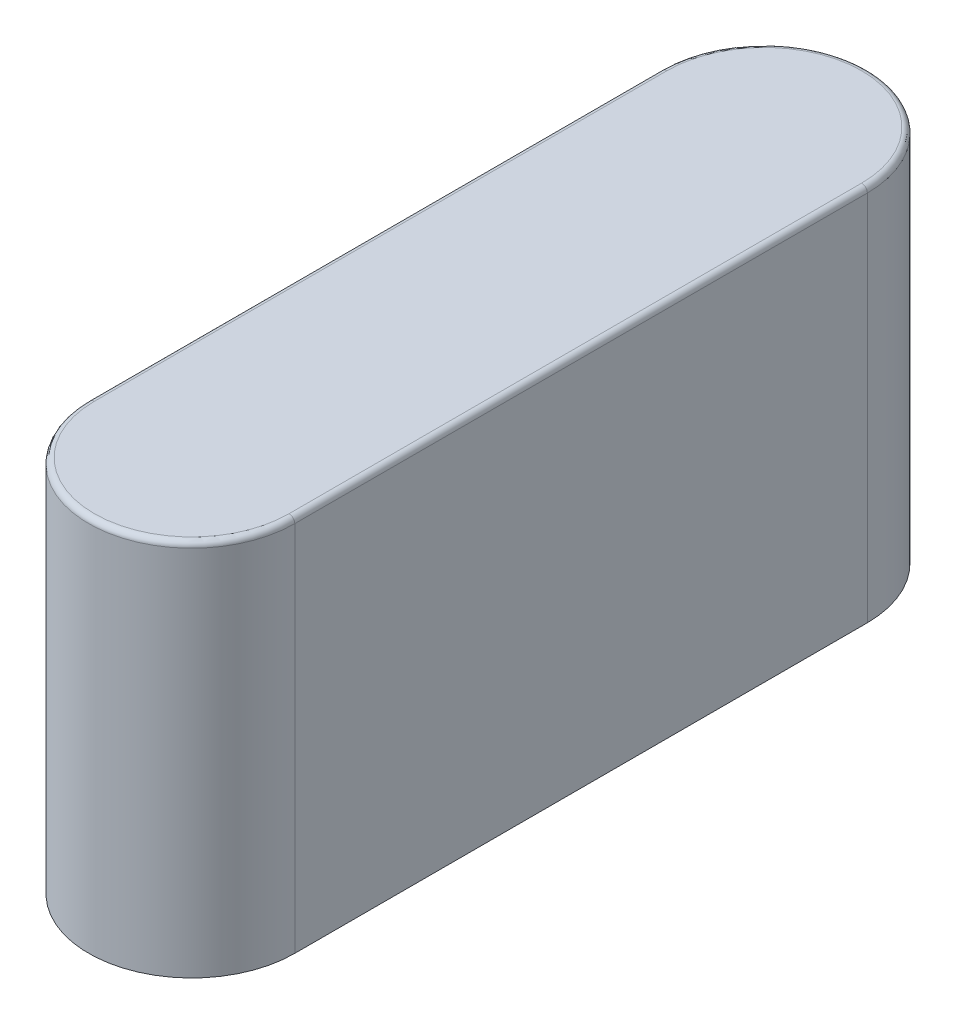
ISO-10303-21;
HEADER;
FILE_DESCRIPTION(('STEP AP214'),'2;1');
FILE_NAME('part.step','',(''),(''),'','','');
FILE_SCHEMA(('AUTOMOTIVE_DESIGN { 1 0 10303 214 1 1 1 1 }'));
ENDSEC;
DATA;
#1=APPLICATION_CONTEXT('core data for automotive mechanical design processes');
#2=APPLICATION_PROTOCOL_DEFINITION('international standard','automotive_design',2000,#1);
#3=PRODUCT_CONTEXT('',#1,'mechanical');
#4=PRODUCT('Part','Part','',(#3));
#5=PRODUCT_RELATED_PRODUCT_CATEGORY('part','',(#4));
#6=PRODUCT_DEFINITION_FORMATION('','',#4);
#7=PRODUCT_DEFINITION_CONTEXT('part definition',#1,'design');
#8=PRODUCT_DEFINITION('design','',#6,#7);
#9=PRODUCT_DEFINITION_SHAPE('','',#8);
#10=(LENGTH_UNIT() NAMED_UNIT(*) SI_UNIT(.MILLI.,.METRE.));
#11=(NAMED_UNIT(*) PLANE_ANGLE_UNIT() SI_UNIT($,.RADIAN.));
#12=(NAMED_UNIT(*) SI_UNIT($,.STERADIAN.) SOLID_ANGLE_UNIT());
#13=UNCERTAINTY_MEASURE_WITH_UNIT(LENGTH_MEASURE(1.E-05),#10,'distance_accuracy_value','');
#14=(GEOMETRIC_REPRESENTATION_CONTEXT(3) GLOBAL_UNCERTAINTY_ASSIGNED_CONTEXT((#13)) GLOBAL_UNIT_ASSIGNED_CONTEXT((#10,
#11,#12)) REPRESENTATION_CONTEXT('',''));
#15=CARTESIAN_POINT('',(0.,0.,0.));
#16=DIRECTION('',(0.,0.,1.));
#17=DIRECTION('',(1.,0.,0.));
#18=AXIS2_PLACEMENT_3D('',#15,#16,#17);
#19=CARTESIAN_POINT('',(0.,1.625,0.744583489501109));
#20=DIRECTION('',(0.,-1.,0.));
#21=DIRECTION('',(0.,0.,-1.));
#22=AXIS2_PLACEMENT_3D('',#19,#20,#21);
#23=TOROIDAL_SURFACE('',#22,0.425,0.025);
#24=CARTESIAN_POINT('',(0.,1.65,0.744583489501109));
#25=DIRECTION('',(0.,1.,0.));
#26=DIRECTION('',(0.,0.,-1.));
#27=AXIS2_PLACEMENT_3D('',#24,#25,#26);
#28=CIRCLE('',#27,0.425);
#29=CARTESIAN_POINT('',(0.425,1.65,0.744583489501109));
#30=VERTEX_POINT('',#29);
#31=CARTESIAN_POINT('',(-0.425,1.65,0.744583489501109));
#32=VERTEX_POINT('',#31);
#33=EDGE_CURVE('E73',#30,#32,#28,.T.);
#34=ORIENTED_EDGE('',*,*,#33,.F.);
#35=CARTESIAN_POINT('',(0.425,1.625,0.744583489501109));
#36=DIRECTION('',(0.,0.,1.));
#37=DIRECTION('',(1.,0.,0.));
#38=AXIS2_PLACEMENT_3D('',#35,#36,#37);
#39=CIRCLE('',#38,0.025);
#40=CARTESIAN_POINT('',(0.45,1.625,0.744583489501109));
#41=VERTEX_POINT('',#40);
#42=EDGE_CURVE('E21',#41,#30,#39,.T.);
#43=ORIENTED_EDGE('',*,*,#42,.F.);
#44=CARTESIAN_POINT('',(0.,1.625,0.744583489501109));
#45=DIRECTION('',(0.,-1.,0.));
#46=DIRECTION('',(0.,0.,-1.));
#47=AXIS2_PLACEMENT_3D('',#44,#45,#46);
#48=CIRCLE('',#47,0.45);
#49=CARTESIAN_POINT('',(-0.45,1.625,0.744583489501109));
#50=VERTEX_POINT('',#49);
#51=EDGE_CURVE('E27',#50,#41,#48,.T.);
#52=ORIENTED_EDGE('',*,*,#51,.F.);
#53=CARTESIAN_POINT('',(-0.425,1.625,0.744583489501109));
#54=DIRECTION('',(0.,0.,-1.));
#55=DIRECTION('',(-1.,0.,0.));
#56=AXIS2_PLACEMENT_3D('',#53,#54,#55);
#57=CIRCLE('',#56,0.025);
#58=EDGE_CURVE('E11',#50,#32,#57,.T.);
#59=ORIENTED_EDGE('',*,*,#58,.T.);
#60=EDGE_LOOP('',(#34,#43,#52,#59));
#61=FACE_BOUND('',#60,.T.);
#62=ADVANCED_FACE('F17',(#61),#23,.T.);
#63=CARTESIAN_POINT('',(0.,1.65,0.744583489501109));
#64=DIRECTION('',(0.,-1.,0.));
#65=DIRECTION('',(0.,0.,-1.));
#66=AXIS2_PLACEMENT_3D('',#63,#64,#65);
#67=CYLINDRICAL_SURFACE('',#66,0.45);
#68=ORIENTED_EDGE('',*,*,#51,.T.);
#69=DIRECTION('',(0.,-1.,0.));
#70=VECTOR('',#69,1.);
#71=CARTESIAN_POINT('',(0.45,1.65,0.744583489501109));
#72=LINE('',#71,#70);
#73=CARTESIAN_POINT('',(0.45,0.,0.744583489501109));
#74=VERTEX_POINT('',#73);
#75=EDGE_CURVE('E116',#41,#74,#72,.T.);
#76=ORIENTED_EDGE('',*,*,#75,.T.);
#77=CARTESIAN_POINT('',(0.,0.,0.744583489501109));
#78=DIRECTION('',(0.,-1.,0.));
#79=DIRECTION('',(0.,0.,-1.));
#80=AXIS2_PLACEMENT_3D('',#77,#78,#79);
#81=CIRCLE('',#80,0.45);
#82=CARTESIAN_POINT('',(-0.45,0.,0.744583489501109));
#83=VERTEX_POINT('',#82);
#84=EDGE_CURVE('E94',#83,#74,#81,.T.);
#85=ORIENTED_EDGE('',*,*,#84,.F.);
#86=DIRECTION('',(0.,-1.,0.));
#87=VECTOR('',#86,1.);
#88=CARTESIAN_POINT('',(-0.45,1.65,0.744583489501109));
#89=LINE('',#88,#87);
#90=EDGE_CURVE('E36',#50,#83,#89,.T.);
#91=ORIENTED_EDGE('',*,*,#90,.F.);
#92=EDGE_LOOP('',(#68,#76,#85,#91));
#93=FACE_BOUND('',#92,.T.);
#94=ADVANCED_FACE('F122',(#93),#67,.T.);
#95=CARTESIAN_POINT('',(-0.45,1.65,0.744583489501109));
#96=DIRECTION('',(1.,0.,0.));
#97=DIRECTION('',(0.,0.,-1.));
#98=AXIS2_PLACEMENT_3D('',#95,#96,#97);
#99=PLANE('',#98);
#100=DIRECTION('',(0.,-1.,0.));
#101=VECTOR('',#100,1.);
#102=CARTESIAN_POINT('',(-0.45,1.65,3.24458348950111));
#103=LINE('',#102,#101);
#104=CARTESIAN_POINT('',(-0.45,1.625,3.24458348950111));
#105=VERTEX_POINT('',#104);
#106=CARTESIAN_POINT('',(-0.45,0.,3.24458348950111));
#107=VERTEX_POINT('',#106);
#108=EDGE_CURVE('E102',#105,#107,#103,.T.);
#109=ORIENTED_EDGE('',*,*,#108,.F.);
#110=DIRECTION('',(0.,0.,-1.));
#111=VECTOR('',#110,1.);
#112=CARTESIAN_POINT('',(-0.45,1.625,0.744583489501109));
#113=LINE('',#112,#111);
#114=EDGE_CURVE('E113',#105,#50,#113,.T.);
#115=ORIENTED_EDGE('',*,*,#114,.T.);
#116=ORIENTED_EDGE('',*,*,#90,.T.);
#117=DIRECTION('',(0.,0.,1.));
#118=VECTOR('',#117,1.);
#119=CARTESIAN_POINT('',(-0.45,0.,0.744583489501109));
#120=LINE('',#119,#118);
#121=EDGE_CURVE('E108',#83,#107,#120,.T.);
#122=ORIENTED_EDGE('',*,*,#121,.T.);
#123=EDGE_LOOP('',(#109,#115,#116,#122));
#124=FACE_BOUND('',#123,.T.);
#125=ADVANCED_FACE('F128',(#124),#99,.F.);
#126=CARTESIAN_POINT('',(0.,1.65,3.24458348950111));
#127=DIRECTION('',(0.,-1.,0.));
#128=DIRECTION('',(0.,0.,-1.));
#129=AXIS2_PLACEMENT_3D('',#126,#127,#128);
#130=CYLINDRICAL_SURFACE('',#129,0.45);
#131=DIRECTION('',(0.,-1.,0.));
#132=VECTOR('',#131,1.);
#133=CARTESIAN_POINT('',(0.45,1.65,3.24458348950111));
#134=LINE('',#133,#132);
#135=CARTESIAN_POINT('',(0.45,1.625,3.24458348950111));
#136=VERTEX_POINT('',#135);
#137=CARTESIAN_POINT('',(0.45,0.,3.24458348950111));
#138=VERTEX_POINT('',#137);
#139=EDGE_CURVE('E100',#136,#138,#134,.T.);
#140=ORIENTED_EDGE('',*,*,#139,.F.);
#141=CARTESIAN_POINT('',(0.,1.625,3.24458348950111));
#142=DIRECTION('',(0.,-1.,0.));
#143=DIRECTION('',(0.,0.,-1.));
#144=AXIS2_PLACEMENT_3D('',#141,#142,#143);
#145=CIRCLE('',#144,0.45);
#146=EDGE_CURVE('E105',#136,#105,#145,.T.);
#147=ORIENTED_EDGE('',*,*,#146,.T.);
#148=ORIENTED_EDGE('',*,*,#108,.T.);
#149=CARTESIAN_POINT('',(0.,0.,3.24458348950111));
#150=DIRECTION('',(0.,-1.,0.));
#151=DIRECTION('',(0.,0.,-1.));
#152=AXIS2_PLACEMENT_3D('',#149,#150,#151);
#153=CIRCLE('',#152,0.45);
#154=EDGE_CURVE('E91',#138,#107,#153,.T.);
#155=ORIENTED_EDGE('',*,*,#154,.F.);
#156=EDGE_LOOP('',(#140,#147,#148,#155));
#157=FACE_BOUND('',#156,.T.);
#158=ADVANCED_FACE('F132',(#157),#130,.T.);
#159=CARTESIAN_POINT('',(0.45,1.65,3.24458348950111));
#160=DIRECTION('',(-1.,0.,0.));
#161=DIRECTION('',(0.,0.,1.));
#162=AXIS2_PLACEMENT_3D('',#159,#160,#161);
#163=PLANE('',#162);
#164=ORIENTED_EDGE('',*,*,#75,.F.);
#165=DIRECTION('',(0.,0.,1.));
#166=VECTOR('',#165,1.);
#167=CARTESIAN_POINT('',(0.45,1.625,3.24458348950111));
#168=LINE('',#167,#166);
#169=EDGE_CURVE('E86',#41,#136,#168,.T.);
#170=ORIENTED_EDGE('',*,*,#169,.T.);
#171=ORIENTED_EDGE('',*,*,#139,.T.);
#172=DIRECTION('',(0.,0.,-1.));
#173=VECTOR('',#172,1.);
#174=CARTESIAN_POINT('',(0.45,0.,3.24458348950111));
#175=LINE('',#174,#173);
#176=EDGE_CURVE('E97',#138,#74,#175,.T.);
#177=ORIENTED_EDGE('',*,*,#176,.T.);
#178=EDGE_LOOP('',(#164,#170,#171,#177));
#179=FACE_BOUND('',#178,.T.);
#180=ADVANCED_FACE('F154',(#179),#163,.F.);
#181=CARTESIAN_POINT('',(0.,1.65,0.744583489501109));
#182=DIRECTION('',(0.,-1.,0.));
#183=DIRECTION('',(0.,0.,-1.));
#184=AXIS2_PLACEMENT_3D('',#181,#182,#183);
#185=PLANE('',#184);
#186=CARTESIAN_POINT('',(0.,1.65,3.24458348950111));
#187=DIRECTION('',(0.,1.,0.));
#188=DIRECTION('',(0.,0.,-1.));
#189=AXIS2_PLACEMENT_3D('',#186,#187,#188);
#190=CIRCLE('',#189,0.425);
#191=CARTESIAN_POINT('',(-0.425,1.65,3.24458348950111));
#192=VERTEX_POINT('',#191);
#193=CARTESIAN_POINT('',(0.425,1.65,3.24458348950111));
#194=VERTEX_POINT('',#193);
#195=EDGE_CURVE('E81',#192,#194,#190,.T.);
#196=ORIENTED_EDGE('',*,*,#195,.T.);
#197=DIRECTION('',(0.,0.,-1.));
#198=VECTOR('',#197,1.);
#199=CARTESIAN_POINT('',(0.425,1.65,0.744583489501109));
#200=LINE('',#199,#198);
#201=EDGE_CURVE('E68',#194,#30,#200,.T.);
#202=ORIENTED_EDGE('',*,*,#201,.T.);
#203=ORIENTED_EDGE('',*,*,#33,.T.);
#204=DIRECTION('',(0.,0.,1.));
#205=VECTOR('',#204,1.);
#206=CARTESIAN_POINT('',(-0.425,1.65,0.744583489501109));
#207=LINE('',#206,#205);
#208=EDGE_CURVE('E77',#32,#192,#207,.T.);
#209=ORIENTED_EDGE('',*,*,#208,.T.);
#210=EDGE_LOOP('',(#196,#202,#203,#209));
#211=FACE_BOUND('',#210,.T.);
#212=ADVANCED_FACE('F79',(#211),#185,.F.);
#213=CARTESIAN_POINT('',(0.,0.,0.744583489501109));
#214=DIRECTION('',(0.,-1.,0.));
#215=DIRECTION('',(0.,0.,-1.));
#216=AXIS2_PLACEMENT_3D('',#213,#214,#215);
#217=PLANE('',#216);
#218=ORIENTED_EDGE('',*,*,#84,.T.);
#219=ORIENTED_EDGE('',*,*,#176,.F.);
#220=ORIENTED_EDGE('',*,*,#154,.T.);
#221=ORIENTED_EDGE('',*,*,#121,.F.);
#222=EDGE_LOOP('',(#218,#219,#220,#221));
#223=FACE_BOUND('',#222,.T.);
#224=ADVANCED_FACE('F141',(#223),#217,.T.);
#225=CARTESIAN_POINT('',(-0.425,1.625,0.744583489501109));
#226=DIRECTION('',(0.,0.,1.));
#227=DIRECTION('',(1.,0.,0.));
#228=AXIS2_PLACEMENT_3D('',#225,#226,#227);
#229=CYLINDRICAL_SURFACE('',#228,0.025);
#230=ORIENTED_EDGE('',*,*,#58,.F.);
#231=ORIENTED_EDGE('',*,*,#114,.F.);
#232=CARTESIAN_POINT('',(-0.425,1.625,3.24458348950111));
#233=DIRECTION('',(0.,0.,1.));
#234=DIRECTION('',(1.,0.,0.));
#235=AXIS2_PLACEMENT_3D('',#232,#233,#234);
#236=CIRCLE('',#235,0.025);
#237=EDGE_CURVE('E89',#192,#105,#236,.T.);
#238=ORIENTED_EDGE('',*,*,#237,.F.);
#239=ORIENTED_EDGE('',*,*,#208,.F.);
#240=EDGE_LOOP('',(#230,#231,#238,#239));
#241=FACE_BOUND('',#240,.T.);
#242=ADVANCED_FACE('F125',(#241),#229,.T.);
#243=CARTESIAN_POINT('',(0.,1.625,3.24458348950111));
#244=DIRECTION('',(0.,-1.,0.));
#245=DIRECTION('',(0.,0.,-1.));
#246=AXIS2_PLACEMENT_3D('',#243,#244,#245);
#247=TOROIDAL_SURFACE('',#246,0.425,0.025);
#248=ORIENTED_EDGE('',*,*,#237,.T.);
#249=ORIENTED_EDGE('',*,*,#146,.F.);
#250=CARTESIAN_POINT('',(0.425,1.625,3.24458348950111));
#251=DIRECTION('',(0.,0.,-1.));
#252=DIRECTION('',(-1.,0.,0.));
#253=AXIS2_PLACEMENT_3D('',#250,#251,#252);
#254=CIRCLE('',#253,0.025);
#255=EDGE_CURVE('E88',#194,#136,#254,.T.);
#256=ORIENTED_EDGE('',*,*,#255,.F.);
#257=ORIENTED_EDGE('',*,*,#195,.F.);
#258=EDGE_LOOP('',(#248,#249,#256,#257));
#259=FACE_BOUND('',#258,.T.);
#260=ADVANCED_FACE('F134',(#259),#247,.T.);
#261=CARTESIAN_POINT('',(0.425,1.625,0.744583489501109));
#262=DIRECTION('',(0.,0.,-1.));
#263=DIRECTION('',(-1.,0.,0.));
#264=AXIS2_PLACEMENT_3D('',#261,#262,#263);
#265=CYLINDRICAL_SURFACE('',#264,0.025);
#266=ORIENTED_EDGE('',*,*,#255,.T.);
#267=ORIENTED_EDGE('',*,*,#169,.F.);
#268=ORIENTED_EDGE('',*,*,#42,.T.);
#269=ORIENTED_EDGE('',*,*,#201,.F.);
#270=EDGE_LOOP('',(#266,#267,#268,#269));
#271=FACE_BOUND('',#270,.T.);
#272=ADVANCED_FACE('F19',(#271),#265,.T.);
#273=CLOSED_SHELL('',(#62,#94,#125,#158,#180,#212,#224,#242,#260,#272));
#274=MANIFOLD_SOLID_BREP('B1',#273);
#275=ADVANCED_BREP_SHAPE_REPRESENTATION('',(#18,#274),#14);
#276=SHAPE_DEFINITION_REPRESENTATION(#9,#275);
ENDSEC;
END-ISO-10303-21;
